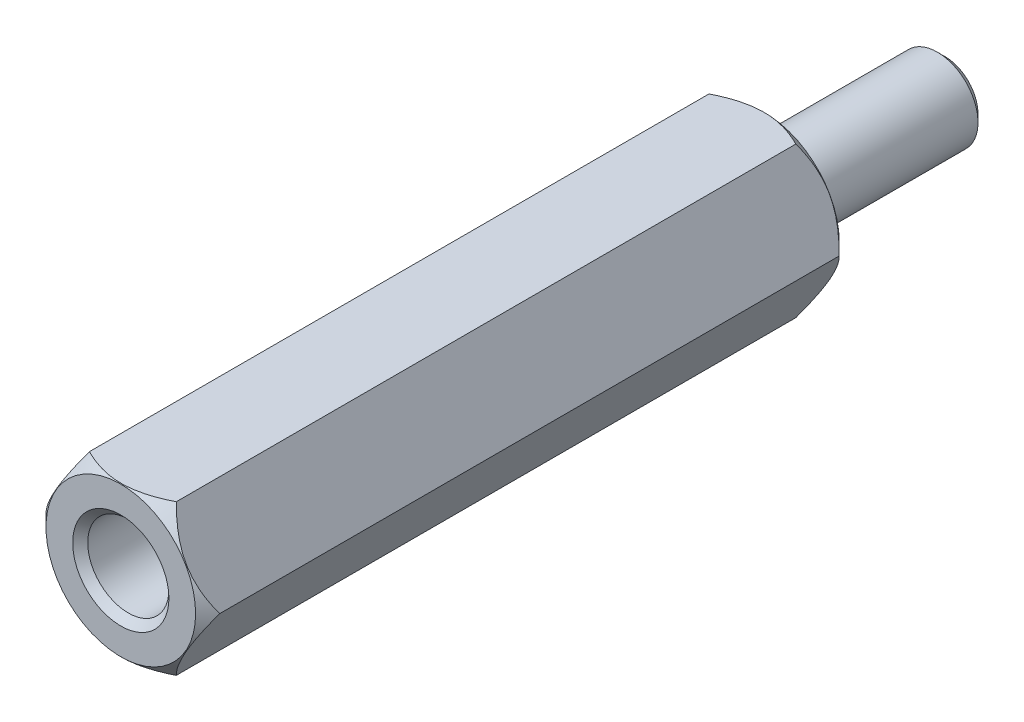
ISO-10303-21;
HEADER;
FILE_DESCRIPTION(('STEP AP214'),'2;1');
FILE_NAME('part.step','',(''),(''),'','','');
FILE_SCHEMA(('AUTOMOTIVE_DESIGN { 1 0 10303 214 1 1 1 1 }'));
ENDSEC;
DATA;
#1=APPLICATION_CONTEXT('core data for automotive mechanical design processes');
#2=APPLICATION_PROTOCOL_DEFINITION('international standard','automotive_design',2000,#1);
#3=PRODUCT_CONTEXT('',#1,'mechanical');
#4=PRODUCT('Part','Part','',(#3));
#5=PRODUCT_RELATED_PRODUCT_CATEGORY('part','',(#4));
#6=PRODUCT_DEFINITION_FORMATION('','',#4);
#7=PRODUCT_DEFINITION_CONTEXT('part definition',#1,'design');
#8=PRODUCT_DEFINITION('design','',#6,#7);
#9=PRODUCT_DEFINITION_SHAPE('','',#8);
#10=(LENGTH_UNIT() NAMED_UNIT(*) SI_UNIT(.MILLI.,.METRE.));
#11=(NAMED_UNIT(*) PLANE_ANGLE_UNIT() SI_UNIT($,.RADIAN.));
#12=(NAMED_UNIT(*) SI_UNIT($,.STERADIAN.) SOLID_ANGLE_UNIT());
#13=UNCERTAINTY_MEASURE_WITH_UNIT(LENGTH_MEASURE(1.E-05),#10,'distance_accuracy_value','');
#14=(GEOMETRIC_REPRESENTATION_CONTEXT(3) GLOBAL_UNCERTAINTY_ASSIGNED_CONTEXT((#13)) GLOBAL_UNIT_ASSIGNED_CONTEXT((#10,
#11,#12)) REPRESENTATION_CONTEXT('',''));
#15=CARTESIAN_POINT('',(0.,0.,0.));
#16=DIRECTION('',(0.,0.,1.));
#17=DIRECTION('',(1.,0.,0.));
#18=AXIS2_PLACEMENT_3D('',#15,#16,#17);
#19=CARTESIAN_POINT('',(0.,0.,10.7));
#20=DIRECTION('',(0.,0.,1.));
#21=DIRECTION('',(1.,0.,0.));
#22=AXIS2_PLACEMENT_3D('',#19,#20,#21);
#23=CYLINDRICAL_SURFACE('',#22,1.35);
#24=CARTESIAN_POINT('',(0.,0.,10.45));
#25=DIRECTION('',(0.,0.,1.));
#26=DIRECTION('',(1.,0.,0.));
#27=AXIS2_PLACEMENT_3D('',#24,#25,#26);
#28=CIRCLE('',#27,1.35);
#29=CARTESIAN_POINT('',(1.35,0.,10.45));
#30=VERTEX_POINT('',#29);
#31=EDGE_CURVE('E53',#30,#30,#28,.T.);
#32=ORIENTED_EDGE('',*,*,#31,.T.);
#33=EDGE_LOOP('',(#32));
#34=FACE_BOUND('',#33,.T.);
#35=CARTESIAN_POINT('',(0.,0.,-8.7));
#36=DIRECTION('',(0.,0.,-1.));
#37=DIRECTION('',(-1.,0.,0.));
#38=AXIS2_PLACEMENT_3D('',#35,#36,#37);
#39=CIRCLE('',#38,1.35);
#40=CARTESIAN_POINT('',(-1.35,0.,-8.7));
#41=VERTEX_POINT('',#40);
#42=EDGE_CURVE('E120',#41,#41,#39,.F.);
#43=ORIENTED_EDGE('',*,*,#42,.F.);
#44=EDGE_LOOP('',(#43));
#45=FACE_BOUND('',#44,.T.);
#46=ADVANCED_FACE('F43',(#34,#45),#23,.F.);
#47=CARTESIAN_POINT('',(1.44337567297409,-2.49999999999998,10.7));
#48=DIRECTION('',(-0.866025403784441,0.499999999999995,0.));
#49=DIRECTION('',(-0.499999999999995,-0.866025403784442,0.));
#50=AXIS2_PLACEMENT_3D('',#47,#48,#49);
#51=PLANE('',#50);
#52=CARTESIAN_POINT('',(1.44326020292026,-2.50019999999999,10.2998845230182));
#53=CARTESIAN_POINT('',(1.49287669073471,-2.41426172221222,10.3494592946453));
#54=CARTESIAN_POINT('',(1.54332283764112,-2.32688643272423,10.3961225186375));
#55=CARTESIAN_POINT('',(1.64618811625262,-2.1487185438344,10.4815618599617));
#56=CARTESIAN_POINT('',(1.69861703122362,-2.05790899931892,10.520290437594));
#57=CARTESIAN_POINT('',(1.80433744175988,-1.87479587687307,10.5866332961023));
#58=CARTESIAN_POINT('',(1.85760201171318,-1.78253893547065,10.6144143314691));
#59=CARTESIAN_POINT('',(1.96530378549011,-1.59599399122371,10.6572168240893));
#60=CARTESIAN_POINT('',(2.01973769896308,-1.50171168743371,10.6722702333286));
#61=CARTESIAN_POINT('',(2.11355131286834,-1.33922174170815,10.6858522777905));
#62=CARTESIAN_POINT('',(2.15280980880343,-1.27122403211985,10.6878629007592));
#63=CARTESIAN_POINT('',(2.23126263056551,-1.13533975883078,10.6844758828125));
#64=CARTESIAN_POINT('',(2.27045692907359,-1.06745324244776,10.6790756447002));
#65=CARTESIAN_POINT('',(2.34847544336506,-0.93232121176389,10.6611742115975));
#66=CARTESIAN_POINT('',(2.38729919566124,-0.865076500246435,10.6486650729535));
#67=CARTESIAN_POINT('',(2.46427534467605,-0.731749899181796,10.6172324980443));
#68=CARTESIAN_POINT('',(2.50242779262543,-0.665667920900338,10.5983095535032));
#69=CARTESIAN_POINT('',(2.60015256308363,-0.496403653308731,10.5421326385917));
#70=CARTESIAN_POINT('',(2.65911894852989,-0.394270877777104,10.5006441684038));
#71=CARTESIAN_POINT('',(2.74582384890658,-0.244093585059488,10.4306059532769));
#72=CARTESIAN_POINT('',(2.77439698586413,-0.194603460117388,10.4059977478839));
#73=CARTESIAN_POINT('',(2.83101398781794,-0.0965399361611517,10.3545381132848));
#74=CARTESIAN_POINT('',(2.85905816495513,-0.047965996503071,10.3276880612206));
#75=CARTESIAN_POINT('',(2.88686681600197,0.000200000000000372,10.2998845230182));
#76=B_SPLINE_CURVE_WITH_KNOTS('',3,(#52,#53,#54,#55,#56,#57,#58,#59,#60,#61,#62,#63,#64,#65,#66,
#67,#68,#69,#70,#71,#72,#73,#74,#75),.UNSPECIFIED.,.F.,.F.,(4,2,2,2,2,2,2,2,2,2,2,4),(0.,
0.333012085133919,0.667964518301388,0.997597032043286,1.32639954393843,1.56169424147167,
1.79707142102081,2.03271213522169,2.26833478775649,2.64260240809531,2.82922877818861,
3.01574133749022),.UNSPECIFIED.);
#77=CARTESIAN_POINT('',(1.44337567297409,-2.49999999999998,10.3));
#78=VERTEX_POINT('',#77);
#79=CARTESIAN_POINT('',(2.88675134594813,0.,10.3));
#80=VERTEX_POINT('',#79);
#81=EDGE_CURVE('E97',#78,#80,#76,.T.);
#82=ORIENTED_EDGE('',*,*,#81,.F.);
#83=DIRECTION('',(0.,0.,-1.));
#84=VECTOR('',#83,1.);
#85=CARTESIAN_POINT('',(1.44337567297409,-2.49999999999998,10.7));
#86=LINE('',#85,#84);
#87=CARTESIAN_POINT('',(1.44337567297409,-2.49999999999998,-10.3));
#88=VERTEX_POINT('',#87);
#89=EDGE_CURVE('E68',#78,#88,#86,.T.);
#90=ORIENTED_EDGE('',*,*,#89,.T.);
#91=CARTESIAN_POINT('',(2.88686681600197,0.000200000000000127,-10.2998845230182));
#92=CARTESIAN_POINT('',(2.83725032818751,-0.0857382777877639,-10.3494592946453));
#93=CARTESIAN_POINT('',(2.7868041812811,-0.173113567275752,-10.3961225186375));
#94=CARTESIAN_POINT('',(2.68393890266961,-0.351281456165585,-10.4815618599617));
#95=CARTESIAN_POINT('',(2.63150998769861,-0.442091000681071,-10.520290437594));
#96=CARTESIAN_POINT('',(2.52578957716235,-0.625204123126915,-10.5866332961023));
#97=CARTESIAN_POINT('',(2.47252500720905,-0.717461064529334,-10.6144143314691));
#98=CARTESIAN_POINT('',(2.36482323343211,-0.904006008776278,-10.6572168240893));
#99=CARTESIAN_POINT('',(2.31038931995914,-0.998288312566274,-10.6722702333286));
#100=CARTESIAN_POINT('',(2.21657570605388,-1.16077825829184,-10.6858522777905));
#101=CARTESIAN_POINT('',(2.1773172101188,-1.22877596788014,-10.6878629007592));
#102=CARTESIAN_POINT('',(2.09886438835672,-1.36466024116921,-10.6844758828125));
#103=CARTESIAN_POINT('',(2.05967008984864,-1.43254675755223,-10.6790756447002));
#104=CARTESIAN_POINT('',(1.98165157555717,-1.5676787882361,-10.6611742115975));
#105=CARTESIAN_POINT('',(1.94282782326099,-1.63492349975355,-10.6486650729535));
#106=CARTESIAN_POINT('',(1.86585167424618,-1.76825010081819,-10.6172324980443));
#107=CARTESIAN_POINT('',(1.8276992262968,-1.83433207909965,-10.5983095535032));
#108=CARTESIAN_POINT('',(1.7299744558386,-2.00359634669125,-10.5421326385917));
#109=CARTESIAN_POINT('',(1.67100807039233,-2.10572912222288,-10.5006441684038));
#110=CARTESIAN_POINT('',(1.58430317001565,-2.2559064149405,-10.4306059532769));
#111=CARTESIAN_POINT('',(1.5557300330581,-2.3053965398826,-10.4059977478839));
#112=CARTESIAN_POINT('',(1.49911303110428,-2.40346006383883,-10.3545381132848));
#113=CARTESIAN_POINT('',(1.47106885396709,-2.45203400349691,-10.3276880612206));
#114=CARTESIAN_POINT('',(1.44326020292026,-2.50019999999999,-10.2998845230182));
#115=B_SPLINE_CURVE_WITH_KNOTS('',3,(#91,#92,#93,#94,#95,#96,#97,#98,#99,#100,#101,#102,#103,
#104,#105,#106,#107,#108,#109,#110,#111,#112,#113,#114),.UNSPECIFIED.,.F.,.F.,(4,2,2,2,2,2,2,2,
2,2,2,4),(0.,0.33301208513392,0.667964518301389,0.997597032043287,1.32639954393843,
1.56169424147167,1.79707142102081,2.03271213522169,2.26833478775649,2.64260240809531,
2.82922877818861,3.01574133749022),.UNSPECIFIED.);
#116=CARTESIAN_POINT('',(2.88675134594813,0.,-10.3));
#117=VERTEX_POINT('',#116);
#118=EDGE_CURVE('E118',#117,#88,#115,.T.);
#119=ORIENTED_EDGE('',*,*,#118,.F.);
#120=DIRECTION('',(0.,0.,-1.));
#121=VECTOR('',#120,1.);
#122=CARTESIAN_POINT('',(2.88675134594813,0.,10.7));
#123=LINE('',#122,#121);
#124=EDGE_CURVE('E111',#80,#117,#123,.T.);
#125=ORIENTED_EDGE('',*,*,#124,.F.);
#126=EDGE_LOOP('',(#82,#90,#119,#125));
#127=FACE_BOUND('',#126,.T.);
#128=ADVANCED_FACE('F117',(#127),#51,.F.);
#129=CARTESIAN_POINT('',(2.88675134594813,0.,10.7));
#130=DIRECTION('',(-0.866025403784438,-0.500000000000001,0.));
#131=DIRECTION('',(0.500000000000001,-0.866025403784438,0.));
#132=AXIS2_PLACEMENT_3D('',#129,#130,#131);
#133=PLANE('',#132);
#134=CARTESIAN_POINT('',(2.88686681600197,-0.000199999999999787,10.2998845230182));
#135=CARTESIAN_POINT('',(2.83725032818751,0.0857382777877644,10.3494592946453));
#136=CARTESIAN_POINT('',(2.7868041812811,0.173113567275753,10.3961225186375));
#137=CARTESIAN_POINT('',(2.6839389026696,0.351281456165588,10.4815618599617));
#138=CARTESIAN_POINT('',(2.6315099876986,0.442091000681074,10.520290437594));
#139=CARTESIAN_POINT('',(2.52578957716234,0.625204123126919,10.5866332961023));
#140=CARTESIAN_POINT('',(2.47252500720904,0.717461064529338,10.6144143314691));
#141=CARTESIAN_POINT('',(2.3648232334321,0.904006008776283,10.6572168240893));
#142=CARTESIAN_POINT('',(2.31038931995913,0.998288312566281,10.6722702333287));
#143=CARTESIAN_POINT('',(2.21657570605387,1.16077825829184,10.6858522777905));
#144=CARTESIAN_POINT('',(2.17731721011878,1.22877596788015,10.6878629007592));
#145=CARTESIAN_POINT('',(2.0988643883567,1.36466024116921,10.6844758828125));
#146=CARTESIAN_POINT('',(2.05967008984862,1.43254675755223,10.6790756447002));
#147=CARTESIAN_POINT('',(1.98165157555715,1.5676787882361,10.6611742115975));
#148=CARTESIAN_POINT('',(1.94282782326097,1.63492349975355,10.6486650729535));
#149=CARTESIAN_POINT('',(1.86585167424616,1.76825010081819,10.6172324980443));
#150=CARTESIAN_POINT('',(1.82769922629678,1.83433207909965,10.5983095535032));
#151=CARTESIAN_POINT('',(1.72997445583858,2.00359634669126,10.5421326385918));
#152=CARTESIAN_POINT('',(1.67100807039231,2.10572912222289,10.5006441684038));
#153=CARTESIAN_POINT('',(1.58430317001562,2.25590641494051,10.4306059532769));
#154=CARTESIAN_POINT('',(1.55573003305807,2.30539653988261,10.4059977478839));
#155=CARTESIAN_POINT('',(1.49911303110425,2.40346006383885,10.3545381132848));
#156=CARTESIAN_POINT('',(1.47106885396706,2.45203400349693,10.3276880612206));
#157=CARTESIAN_POINT('',(1.44326020292022,2.50020000000001,10.2998845230182));
#158=B_SPLINE_CURVE_WITH_KNOTS('',3,(#134,#135,#136,#137,#138,#139,#140,#141,#142,#143,#144,
#145,#146,#147,#148,#149,#150,#151,#152,#153,#154,#155,#156,#157),.UNSPECIFIED.,.F.,.F.,(4,2,2,
2,2,2,2,2,2,2,2,4),(0.,0.333012085133923,0.667964518301396,0.997597032043297,1.32639954393844,
1.56169424147168,1.79707142102082,2.0327121352217,2.2683347877565,2.64260240809533,
2.82922877818864,3.01574133749026),.UNSPECIFIED.);
#159=CARTESIAN_POINT('',(1.44337567297406,2.50000000000001,10.3));
#160=VERTEX_POINT('',#159);
#161=EDGE_CURVE('E100',#80,#160,#158,.T.);
#162=ORIENTED_EDGE('',*,*,#161,.F.);
#163=ORIENTED_EDGE('',*,*,#124,.T.);
#164=CARTESIAN_POINT('',(1.44326020292022,2.50020000000001,-10.2998845230182));
#165=CARTESIAN_POINT('',(1.49287669073468,2.41426172221224,-10.3494592946453));
#166=CARTESIAN_POINT('',(1.54332283764109,2.32688643272425,-10.3961225186375));
#167=CARTESIAN_POINT('',(1.64618811625259,2.14871854383442,-10.4815618599617));
#168=CARTESIAN_POINT('',(1.69861703122359,2.05790899931893,-10.520290437594));
#169=CARTESIAN_POINT('',(1.80433744175985,1.87479587687309,-10.5866332961023));
#170=CARTESIAN_POINT('',(1.85760201171315,1.78253893547067,-10.6144143314691));
#171=CARTESIAN_POINT('',(1.96530378549009,1.59599399122372,-10.6572168240893));
#172=CARTESIAN_POINT('',(2.01973769896306,1.50171168743372,-10.6722702333287));
#173=CARTESIAN_POINT('',(2.11355131286832,1.33922174170816,-10.6858522777905));
#174=CARTESIAN_POINT('',(2.15280980880341,1.27122403211986,-10.6878629007592));
#175=CARTESIAN_POINT('',(2.23126263056549,1.13533975883079,-10.6844758828125));
#176=CARTESIAN_POINT('',(2.27045692907357,1.06745324244777,-10.6790756447002));
#177=CARTESIAN_POINT('',(2.34847544336504,0.932321211763905,-10.6611742115975));
#178=CARTESIAN_POINT('',(2.38729919566122,0.865076500246451,-10.6486650729535));
#179=CARTESIAN_POINT('',(2.46427534467603,0.731749899181814,-10.6172324980443));
#180=CARTESIAN_POINT('',(2.50242779262541,0.665667920900356,-10.5983095535032));
#181=CARTESIAN_POINT('',(2.60015256308361,0.496403653308746,-10.5421326385918));
#182=CARTESIAN_POINT('',(2.65911894852988,0.394270877777116,-10.5006441684038));
#183=CARTESIAN_POINT('',(2.74582384890657,0.244093585059497,-10.4306059532769));
#184=CARTESIAN_POINT('',(2.77439698586412,0.194603460117396,-10.4059977478839));
#185=CARTESIAN_POINT('',(2.83101398781794,0.0965399361611562,-10.3545381132848));
#186=CARTESIAN_POINT('',(2.85905816495513,0.0479659965030738,-10.3276880612206));
#187=CARTESIAN_POINT('',(2.88686681600197,-0.000199999999999583,-10.2998845230182));
#188=B_SPLINE_CURVE_WITH_KNOTS('',3,(#164,#165,#166,#167,#168,#169,#170,#171,#172,#173,#174,
#175,#176,#177,#178,#179,#180,#181,#182,#183,#184,#185,#186,#187),.UNSPECIFIED.,.F.,.F.,(4,2,2,
2,2,2,2,2,2,2,2,4),(0.,0.333012085133923,0.667964518301396,0.997597032043298,1.32639954393844,
1.56169424147168,1.79707142102082,2.0327121352217,2.2683347877565,2.64260240809533,
2.82922877818864,3.01574133749026),.UNSPECIFIED.);
#189=CARTESIAN_POINT('',(1.44337567297406,2.50000000000001,-10.3));
#190=VERTEX_POINT('',#189);
#191=EDGE_CURVE('E250',#190,#117,#188,.T.);
#192=ORIENTED_EDGE('',*,*,#191,.F.);
#193=DIRECTION('',(0.,0.,-1.));
#194=VECTOR('',#193,1.);
#195=CARTESIAN_POINT('',(1.44337567297406,2.50000000000001,10.7));
#196=LINE('',#195,#194);
#197=EDGE_CURVE('E113',#160,#190,#196,.T.);
#198=ORIENTED_EDGE('',*,*,#197,.F.);
#199=EDGE_LOOP('',(#162,#163,#192,#198));
#200=FACE_BOUND('',#199,.T.);
#201=ADVANCED_FACE('F109',(#200),#133,.F.);
#202=CARTESIAN_POINT('',(1.44337567297406,2.50000000000001,10.7));
#203=DIRECTION('',(0.,-1.,0.));
#204=DIRECTION('',(1.,0.,0.));
#205=AXIS2_PLACEMENT_3D('',#202,#203,#204);
#206=PLANE('',#205);
#207=CARTESIAN_POINT('',(4.35790807222665,2.50000000000002,8.16267304580408));
#208=CARTESIAN_POINT('',(4.22900505074815,2.50000000000001,8.27444020651167));
#209=CARTESIAN_POINT('',(4.09952897907173,2.50000000000001,8.38556009439582));
#210=CARTESIAN_POINT('',(3.83898638028681,2.50000000000001,8.60604374915113));
#211=CARTESIAN_POINT('',(3.70791912620545,2.50000000000001,8.71540665588042));
#212=CARTESIAN_POINT('',(3.44083760855068,2.50000000000001,8.9342940749196));
#213=CARTESIAN_POINT('',(3.30477887797079,2.50000000000001,9.04376454299068));
#214=CARTESIAN_POINT('',(3.03009587684348,2.50000000000001,9.25938263287971));
#215=CARTESIAN_POINT('',(2.89147225782007,2.50000000000001,9.36553108059659));
#216=CARTESIAN_POINT('',(2.61062429451693,2.50000000000001,9.57338578520496));
#217=CARTESIAN_POINT('',(2.46839537969834,2.50000000000001,9.67508590704004));
#218=CARTESIAN_POINT('',(2.1792548679078,2.50000000000001,9.87194970638111));
#219=CARTESIAN_POINT('',(2.03233957265132,2.50000000000001,9.96710802470616));
#220=CARTESIAN_POINT('',(1.73361597358269,2.50000000000001,10.1468083373489));
#221=CARTESIAN_POINT('',(1.58185407011246,2.50000000000001,10.2314264527755));
#222=CARTESIAN_POINT('',(1.27084130527911,2.5,10.3855259959545));
#223=CARTESIAN_POINT('',(1.11160488303033,2.5,10.4550352568887));
#224=CARTESIAN_POINT('',(0.864657376231813,2.5,10.5425964251353));
#225=CARTESIAN_POINT('',(0.77999302622253,2.5,10.5692004630506));
#226=CARTESIAN_POINT('',(0.608668935092183,2.5,10.6150458234607));
#227=CARTESIAN_POINT('',(0.522009514777902,2.5,10.6342883210428));
#228=CARTESIAN_POINT('',(0.347739556932347,2.5,10.6641318069513));
#229=CARTESIAN_POINT('',(0.260138222188833,2.5,10.6747855278333));
#230=CARTESIAN_POINT('',(0.0842961272603256,2.5,10.6868677030715));
#231=CARTESIAN_POINT('',(-0.00394456438843409,2.5,10.6882971320023));
#232=CARTESIAN_POINT('',(-0.180192018780201,2.5,10.6818160827615));
#233=CARTESIAN_POINT('',(-0.268198313940574,2.5,10.6738931726444));
#234=CARTESIAN_POINT('',(-0.442968473014165,2.5,10.6492869360214));
#235=CARTESIAN_POINT('',(-0.529732088460496,2.5,10.6326018820153));
#236=CARTESIAN_POINT('',(-0.702003641636127,2.5,10.5914180760622));
#237=CARTESIAN_POINT('',(-0.787498274243343,2.5,10.5668646390626));
#238=CARTESIAN_POINT('',(-0.956318998116772,2.5,10.5112722791982));
#239=CARTESIAN_POINT('',(-1.03964506444262,2.5,10.480233281781));
#240=CARTESIAN_POINT('',(-1.22260914379835,2.5,10.4053275261388));
#241=CARTESIAN_POINT('',(-1.32170415747563,2.5,10.3601455930875));
#242=CARTESIAN_POINT('',(-1.51694385371059,2.49999999999999,10.2637551537921));
#243=CARTESIAN_POINT('',(-1.61308679170484,2.49999999999999,10.212543167265));
#244=CARTESIAN_POINT('',(-1.80296614219628,2.49999999999999,10.105431667411));
#245=CARTESIAN_POINT('',(-1.89669715950606,2.49999999999999,10.0495226676025));
#246=CARTESIAN_POINT('',(-2.08192800240938,2.49999999999999,9.93418674307867));
#247=CARTESIAN_POINT('',(-2.17342826625812,2.49999999999999,9.87476051735269));
#248=CARTESIAN_POINT('',(-2.35505847652758,2.49999999999999,9.75284030367594));
#249=CARTESIAN_POINT('',(-2.445178569973,2.49999999999999,9.69033170499247));
#250=CARTESIAN_POINT('',(-2.62385919422445,2.49999999999999,9.5631187500085));
#251=CARTESIAN_POINT('',(-2.71241960671451,2.49999999999999,9.49841422820778));
#252=CARTESIAN_POINT('',(-2.9759396860953,2.49999999999999,9.30184992046114));
#253=CARTESIAN_POINT('',(-3.14895696314837,2.49999999999999,9.16738929484152));
#254=CARTESIAN_POINT('',(-3.49727644035012,2.49999999999999,8.88911816701071));
#255=CARTESIAN_POINT('',(-3.67244750970816,2.49999999999999,8.74514512901895));
#256=CARTESIAN_POINT('',(-3.93212110001528,2.49999999999999,8.52741624538674));
#257=CARTESIAN_POINT('',(-4.01770626505474,2.49999999999999,8.45494531232854));
#258=CARTESIAN_POINT('',(-4.1882495214834,2.49999999999999,8.30930608888148));
#259=CARTESIAN_POINT('',(-4.27320774421479,2.49999999999999,8.23613795236392));
#260=CARTESIAN_POINT('',(-4.35790807222667,2.49999999999999,8.16267304580408));
#261=B_SPLINE_CURVE_WITH_KNOTS('',3,(#207,#208,#209,#210,#211,#212,#213,#214,#215,#216,#217,
#218,#219,#220,#221,#222,#223,#224,#225,#226,#227,#228,#229,#230,#231,#232,#233,#234,#235,#236,
#237,#238,#239,#240,#241,#242,#243,#244,#245,#246,#247,#248,#249,#250,#251,#252,#253,#254,#255,
#256,#257,#258,#259,#260),.UNSPECIFIED.,.F.,.F.,(4,2,2,2,2,2,2,2,2,2,2,2,2,2,2,2,2,2,2,2,2,2,2,
2,2,2,4),(0.,0.511842212813335,1.02392780167291,1.54778169920521,2.07150430797679,
2.59592780979256,3.12077593308527,3.6415817306556,4.16141982425733,4.42739176689035,
4.69332123596951,4.95760526901694,5.22186137919604,5.48646915760419,5.75112912434678,
6.01766988465733,6.28421370906122,6.61066447125654,6.93730457870704,7.26462103112127,
7.59187265192314,7.92086150920109,8.24987521669911,8.90710736338418,9.5872861612455,
9.92372274140157,10.2600867154781),.UNSPECIFIED.);
#262=CARTESIAN_POINT('',(-1.44337567297408,2.5,10.3));
#263=VERTEX_POINT('',#262);
#264=EDGE_CURVE('E115',#160,#263,#261,.T.);
#265=ORIENTED_EDGE('',*,*,#264,.F.);
#266=ORIENTED_EDGE('',*,*,#197,.T.);
#267=CARTESIAN_POINT('',(-4.35790807222667,2.49999999999999,-8.16267304580408));
#268=CARTESIAN_POINT('',(-4.22900505074817,2.49999999999999,-8.27444020651167));
#269=CARTESIAN_POINT('',(-4.09952897907174,2.49999999999999,-8.38556009439582));
#270=CARTESIAN_POINT('',(-3.83898638028683,2.49999999999999,-8.60604374915113));
#271=CARTESIAN_POINT('',(-3.70791912620547,2.49999999999999,-8.71540665588042));
#272=CARTESIAN_POINT('',(-3.44083760855069,2.49999999999999,-8.9342940749196));
#273=CARTESIAN_POINT('',(-3.30477887797081,2.49999999999999,-9.04376454299068));
#274=CARTESIAN_POINT('',(-3.03009587684349,2.49999999999999,-9.25938263287971));
#275=CARTESIAN_POINT('',(-2.89147225782009,2.49999999999999,-9.36553108059659));
#276=CARTESIAN_POINT('',(-2.61062429451694,2.49999999999999,-9.57338578520496));
#277=CARTESIAN_POINT('',(-2.46839537969836,2.49999999999999,-9.67508590704004));
#278=CARTESIAN_POINT('',(-2.17925486790782,2.49999999999999,-9.87194970638111));
#279=CARTESIAN_POINT('',(-2.03233957265134,2.49999999999999,-9.96710802470616));
#280=CARTESIAN_POINT('',(-1.73361597358271,2.49999999999999,-10.1468083373489));
#281=CARTESIAN_POINT('',(-1.58185407011248,2.49999999999999,-10.2314264527755));
#282=CARTESIAN_POINT('',(-1.27084130527913,2.5,-10.3855259959545));
#283=CARTESIAN_POINT('',(-1.11160488303035,2.5,-10.4550352568887));
#284=CARTESIAN_POINT('',(-0.864657376231833,2.5,-10.5425964251353));
#285=CARTESIAN_POINT('',(-0.779993026222549,2.5,-10.5692004630506));
#286=CARTESIAN_POINT('',(-0.608668935092202,2.5,-10.6150458234607));
#287=CARTESIAN_POINT('',(-0.522009514777922,2.5,-10.6342883210428));
#288=CARTESIAN_POINT('',(-0.347739556932367,2.5,-10.6641318069513));
#289=CARTESIAN_POINT('',(-0.260138222188853,2.5,-10.6747855278333));
#290=CARTESIAN_POINT('',(-0.0842961272603451,2.5,-10.6868677030715));
#291=CARTESIAN_POINT('',(0.0039445643884146,2.5,-10.6882971320023));
#292=CARTESIAN_POINT('',(0.180192018780182,2.5,-10.6818160827615));
#293=CARTESIAN_POINT('',(0.268198313940555,2.5,-10.6738931726444));
#294=CARTESIAN_POINT('',(0.442968473014146,2.5,-10.6492869360214));
#295=CARTESIAN_POINT('',(0.529732088460477,2.5,-10.6326018820153));
#296=CARTESIAN_POINT('',(0.702003641636108,2.5,-10.5914180760622));
#297=CARTESIAN_POINT('',(0.787498274243325,2.5,-10.5668646390626));
#298=CARTESIAN_POINT('',(0.956318998116754,2.5,-10.5112722791982));
#299=CARTESIAN_POINT('',(1.0396450644426,2.5,-10.480233281781));
#300=CARTESIAN_POINT('',(1.22260914379833,2.5,-10.4053275261388));
#301=CARTESIAN_POINT('',(1.32170415747562,2.5,-10.3601455930875));
#302=CARTESIAN_POINT('',(1.51694385371057,2.50000000000001,-10.2637551537921));
#303=CARTESIAN_POINT('',(1.61308679170483,2.50000000000001,-10.212543167265));
#304=CARTESIAN_POINT('',(1.80296614219626,2.50000000000001,-10.105431667411));
#305=CARTESIAN_POINT('',(1.89669715950604,2.50000000000001,-10.0495226676025));
#306=CARTESIAN_POINT('',(2.08192800240936,2.50000000000001,-9.93418674307867));
#307=CARTESIAN_POINT('',(2.1734282662581,2.50000000000001,-9.87476051735269));
#308=CARTESIAN_POINT('',(2.35505847652756,2.50000000000001,-9.75284030367594));
#309=CARTESIAN_POINT('',(2.44517856997298,2.50000000000001,-9.69033170499247));
#310=CARTESIAN_POINT('',(2.62385919422443,2.50000000000001,-9.5631187500085));
#311=CARTESIAN_POINT('',(2.71241960671449,2.50000000000001,-9.49841422820778));
#312=CARTESIAN_POINT('',(2.97593968609528,2.50000000000001,-9.30184992046114));
#313=CARTESIAN_POINT('',(3.14895696314835,2.50000000000001,-9.16738929484152));
#314=CARTESIAN_POINT('',(3.4972764403501,2.50000000000001,-8.88911816701071));
#315=CARTESIAN_POINT('',(3.67244750970814,2.50000000000001,-8.74514512901895));
#316=CARTESIAN_POINT('',(3.93212110001526,2.50000000000001,-8.52741624538674));
#317=CARTESIAN_POINT('',(4.01770626505472,2.50000000000001,-8.45494531232854));
#318=CARTESIAN_POINT('',(4.18824952148338,2.50000000000001,-8.30930608888148));
#319=CARTESIAN_POINT('',(4.27320774421478,2.50000000000001,-8.23613795236392));
#320=CARTESIAN_POINT('',(4.35790807222665,2.50000000000002,-8.16267304580408));
#321=B_SPLINE_CURVE_WITH_KNOTS('',3,(#267,#268,#269,#270,#271,#272,#273,#274,#275,#276,#277,
#278,#279,#280,#281,#282,#283,#284,#285,#286,#287,#288,#289,#290,#291,#292,#293,#294,#295,#296,
#297,#298,#299,#300,#301,#302,#303,#304,#305,#306,#307,#308,#309,#310,#311,#312,#313,#314,#315,
#316,#317,#318,#319,#320),.UNSPECIFIED.,.F.,.F.,(4,2,2,2,2,2,2,2,2,2,2,2,2,2,2,2,2,2,2,2,2,2,2,
2,2,2,4),(0.,0.511842212813336,1.02392780167291,1.54778169920521,2.07150430797679,
2.59592780979256,3.12077593308527,3.6415817306556,4.16141982425733,4.42739176689035,
4.69332123596951,4.95760526901694,5.22186137919604,5.48646915760419,5.75112912434678,
6.01766988465733,6.28421370906122,6.61066447125654,6.93730457870704,7.26462103112127,
7.59187265192314,7.92086150920109,8.24987521669912,8.90710736338418,9.5872861612455,
9.92372274140157,10.2600867154781),.UNSPECIFIED.);
#322=CARTESIAN_POINT('',(-1.44337567297408,2.5,-10.3));
#323=VERTEX_POINT('',#322);
#324=EDGE_CURVE('E258',#323,#190,#321,.T.);
#325=ORIENTED_EDGE('',*,*,#324,.F.);
#326=DIRECTION('',(0.,0.,-1.));
#327=VECTOR('',#326,1.);
#328=CARTESIAN_POINT('',(-1.44337567297408,2.5,10.7));
#329=LINE('',#328,#327);
#330=EDGE_CURVE('E127',#263,#323,#329,.T.);
#331=ORIENTED_EDGE('',*,*,#330,.F.);
#332=EDGE_LOOP('',(#265,#266,#325,#331));
#333=FACE_BOUND('',#332,.T.);
#334=ADVANCED_FACE('F244',(#333),#206,.F.);
#335=CARTESIAN_POINT('',(-1.44337567297408,2.5,10.7));
#336=DIRECTION('',(0.866025403784441,-0.499999999999995,0.));
#337=DIRECTION('',(0.499999999999995,0.866025403784442,0.));
#338=AXIS2_PLACEMENT_3D('',#335,#336,#337);
#339=PLANE('',#338);
#340=CARTESIAN_POINT('',(-1.44326020292024,2.5002,10.2998845230182));
#341=CARTESIAN_POINT('',(-1.4928766907347,2.41426172221223,10.3494592946453));
#342=CARTESIAN_POINT('',(-1.54332283764111,2.32688643272424,10.3961225186375));
#343=CARTESIAN_POINT('',(-1.6461881162526,2.14871854383441,10.4815618599617));
#344=CARTESIAN_POINT('',(-1.6986170312236,2.05790899931892,10.520290437594));
#345=CARTESIAN_POINT('',(-1.80433744175986,1.87479587687307,10.5866332961023));
#346=CARTESIAN_POINT('',(-1.85760201171316,1.78253893547065,10.6144143314691));
#347=CARTESIAN_POINT('',(-1.9653037854901,1.59599399122371,10.6572168240893));
#348=CARTESIAN_POINT('',(-2.01973769896307,1.50171168743371,10.6722702333287));
#349=CARTESIAN_POINT('',(-2.11355131286833,1.33922174170815,10.6858522777905));
#350=CARTESIAN_POINT('',(-2.15280980880342,1.27122403211984,10.6878629007592));
#351=CARTESIAN_POINT('',(-2.2312626305655,1.13533975883077,10.6844758828125));
#352=CARTESIAN_POINT('',(-2.27045692907358,1.06745324244776,10.6790756447002));
#353=CARTESIAN_POINT('',(-2.34847544336505,0.932321211763889,10.6611742115975));
#354=CARTESIAN_POINT('',(-2.38729919566123,0.865076500246435,10.6486650729535));
#355=CARTESIAN_POINT('',(-2.46427534467603,0.731749899181797,10.6172324980443));
#356=CARTESIAN_POINT('',(-2.50242779262542,0.665667920900339,10.5983095535032));
#357=CARTESIAN_POINT('',(-2.60015256308362,0.496403653308728,10.5421326385918));
#358=CARTESIAN_POINT('',(-2.65911894852989,0.394270877777098,10.5006441684038));
#359=CARTESIAN_POINT('',(-2.74582384890657,0.244093585059477,10.4306059532769));
#360=CARTESIAN_POINT('',(-2.77439698586412,0.194603460117375,10.4059977478839));
#361=CARTESIAN_POINT('',(-2.83101398781794,0.0965399361611348,10.3545381132848));
#362=CARTESIAN_POINT('',(-2.85905816495513,0.0479659965030524,10.3276880612206));
#363=CARTESIAN_POINT('',(-2.88686681600197,-0.000200000000020783,10.2998845230182));
#364=B_SPLINE_CURVE_WITH_KNOTS('',3,(#340,#341,#342,#343,#344,#345,#346,#347,#348,#349,#350,
#351,#352,#353,#354,#355,#356,#357,#358,#359,#360,#361,#362,#363),.UNSPECIFIED.,.F.,.F.,(4,2,2,
2,2,2,2,2,2,2,2,4),(0.,0.333012085133924,0.667964518301397,0.997597032043299,1.32639954393844,
1.56169424147168,1.79707142102082,2.0327121352217,2.2683347877565,2.64260240809533,
2.82922877818864,3.01574133749026),.UNSPECIFIED.);
#365=CARTESIAN_POINT('',(-2.88675134594813,0.,10.3));
#366=VERTEX_POINT('',#365);
#367=EDGE_CURVE('E222',#263,#366,#364,.T.);
#368=ORIENTED_EDGE('',*,*,#367,.F.);
#369=ORIENTED_EDGE('',*,*,#330,.T.);
#370=CARTESIAN_POINT('',(-2.88686681600197,-0.000200000000020285,-10.2998845230182));
#371=CARTESIAN_POINT('',(-2.83725032818751,0.0857382777877441,-10.3494592946453));
#372=CARTESIAN_POINT('',(-2.7868041812811,0.173113567275733,-10.3961225186375));
#373=CARTESIAN_POINT('',(-2.68393890266961,0.351281456165568,-10.4815618599617));
#374=CARTESIAN_POINT('',(-2.63150998769861,0.442091000681055,-10.520290437594));
#375=CARTESIAN_POINT('',(-2.52578957716234,0.625204123126901,-10.5866332961023));
#376=CARTESIAN_POINT('',(-2.47252500720905,0.717461064529321,-10.6144143314691));
#377=CARTESIAN_POINT('',(-2.36482323343211,0.904006008776267,-10.6572168240893));
#378=CARTESIAN_POINT('',(-2.31038931995914,0.998288312566264,-10.6722702333287));
#379=CARTESIAN_POINT('',(-2.21657570605388,1.16077825829183,-10.6858522777905));
#380=CARTESIAN_POINT('',(-2.17731721011879,1.22877596788013,-10.6878629007592));
#381=CARTESIAN_POINT('',(-2.09886438835671,1.3646602411692,-10.6844758828125));
#382=CARTESIAN_POINT('',(-2.05967008984863,1.43254675755222,-10.6790756447002));
#383=CARTESIAN_POINT('',(-1.98165157555716,1.56767878823609,-10.6611742115975));
#384=CARTESIAN_POINT('',(-1.94282782326098,1.63492349975354,-10.6486650729535));
#385=CARTESIAN_POINT('',(-1.86585167424617,1.76825010081818,-10.6172324980443));
#386=CARTESIAN_POINT('',(-1.82769922629679,1.83433207909964,-10.5983095535032));
#387=CARTESIAN_POINT('',(-1.72997445583859,2.00359634669125,-10.5421326385918));
#388=CARTESIAN_POINT('',(-1.67100807039232,2.10572912222288,-10.5006441684038));
#389=CARTESIAN_POINT('',(-1.58430317001564,2.2559064149405,-10.4306059532769));
#390=CARTESIAN_POINT('',(-1.55573003305809,2.3053965398826,-10.4059977478839));
#391=CARTESIAN_POINT('',(-1.49911303110427,2.40346006383884,-10.3545381132848));
#392=CARTESIAN_POINT('',(-1.47106885396707,2.45203400349692,-10.3276880612206));
#393=CARTESIAN_POINT('',(-1.44326020292024,2.5002,-10.2998845230182));
#394=B_SPLINE_CURVE_WITH_KNOTS('',3,(#370,#371,#372,#373,#374,#375,#376,#377,#378,#379,#380,
#381,#382,#383,#384,#385,#386,#387,#388,#389,#390,#391,#392,#393),.UNSPECIFIED.,.F.,.F.,(4,2,2,
2,2,2,2,2,2,2,2,4),(0.,0.333012085133924,0.667964518301396,0.997597032043298,1.32639954393844,
1.56169424147168,1.79707142102082,2.0327121352217,2.2683347877565,2.64260240809533,
2.82922877818864,3.01574133749026),.UNSPECIFIED.);
#395=CARTESIAN_POINT('',(-2.88675134594813,0.,-10.3));
#396=VERTEX_POINT('',#395);
#397=EDGE_CURVE('E285',#396,#323,#394,.T.);
#398=ORIENTED_EDGE('',*,*,#397,.F.);
#399=DIRECTION('',(0.,0.,-1.));
#400=VECTOR('',#399,1.);
#401=CARTESIAN_POINT('',(-2.88675134594813,0.,10.7));
#402=LINE('',#401,#400);
#403=EDGE_CURVE('E275',#366,#396,#402,.T.);
#404=ORIENTED_EDGE('',*,*,#403,.F.);
#405=EDGE_LOOP('',(#368,#369,#398,#404));
#406=FACE_BOUND('',#405,.T.);
#407=ADVANCED_FACE('F283',(#406),#339,.F.);
#408=CARTESIAN_POINT('',(-2.88675134594813,0.,10.7));
#409=DIRECTION('',(0.866025403784435,0.500000000000007,0.));
#410=DIRECTION('',(-0.500000000000007,0.866025403784435,0.));
#411=AXIS2_PLACEMENT_3D('',#408,#409,#410);
#412=PLANE('',#411);
#413=CARTESIAN_POINT('',(-2.88686681600197,0.000199999999979627,10.2998845230182));
#414=CARTESIAN_POINT('',(-2.83725032818751,-0.0857382777877845,10.3494592946453));
#415=CARTESIAN_POINT('',(-2.7868041812811,-0.173113567275772,10.3961225186375));
#416=CARTESIAN_POINT('',(-2.6839389026696,-0.351281456165606,10.4815618599617));
#417=CARTESIAN_POINT('',(-2.6315099876986,-0.442091000681092,10.520290437594));
#418=CARTESIAN_POINT('',(-2.52578957716233,-0.625204123126937,10.5866332961023));
#419=CARTESIAN_POINT('',(-2.47252500720904,-0.717461064529356,10.6144143314691));
#420=CARTESIAN_POINT('',(-2.3648232334321,-0.9040060087763,10.6572168240893));
#421=CARTESIAN_POINT('',(-2.31038931995912,-0.998288312566297,10.6722702333287));
#422=CARTESIAN_POINT('',(-2.21657570605386,-1.16077825829186,10.6858522777905));
#423=CARTESIAN_POINT('',(-2.17731721011877,-1.22877596788016,10.6878629007592));
#424=CARTESIAN_POINT('',(-2.09886438835669,-1.36466024116923,10.6844758828125));
#425=CARTESIAN_POINT('',(-2.05967008984861,-1.43254675755225,10.6790756447002));
#426=CARTESIAN_POINT('',(-1.98165157555714,-1.56767878823611,10.6611742115975));
#427=CARTESIAN_POINT('',(-1.94282782326096,-1.63492349975357,10.6486650729535));
#428=CARTESIAN_POINT('',(-1.86585167424615,-1.7682501008182,10.6172324980443));
#429=CARTESIAN_POINT('',(-1.82769922629677,-1.83433207909966,10.5983095535032));
#430=CARTESIAN_POINT('',(-1.72997445583856,-2.00359634669127,10.5421326385918));
#431=CARTESIAN_POINT('',(-1.67100807039229,-2.1057291222229,10.5006441684038));
#432=CARTESIAN_POINT('',(-1.58430317001561,-2.25590641494052,10.4306059532769));
#433=CARTESIAN_POINT('',(-1.55573003305805,-2.30539653988262,10.4059977478839));
#434=CARTESIAN_POINT('',(-1.49911303110423,-2.40346006383886,10.3545381132848));
#435=CARTESIAN_POINT('',(-1.47106885396704,-2.45203400349694,10.3276880612206));
#436=CARTESIAN_POINT('',(-1.4432602029202,-2.50020000000002,10.2998845230182));
#437=B_SPLINE_CURVE_WITH_KNOTS('',3,(#413,#414,#415,#416,#417,#418,#419,#420,#421,#422,#423,
#424,#425,#426,#427,#428,#429,#430,#431,#432,#433,#434,#435,#436),.UNSPECIFIED.,.F.,.F.,(4,2,2,
2,2,2,2,2,2,2,2,4),(0.,0.333012085133923,0.667964518301396,0.997597032043297,1.32639954393844,
1.56169424147168,1.79707142102082,2.0327121352217,2.2683347877565,2.64260240809533,
2.82922877818864,3.01574133749026),.UNSPECIFIED.);
#438=CARTESIAN_POINT('',(-1.44337567297404,-2.50000000000001,10.3));
#439=VERTEX_POINT('',#438);
#440=EDGE_CURVE('E60',#366,#439,#437,.T.);
#441=ORIENTED_EDGE('',*,*,#440,.F.);
#442=ORIENTED_EDGE('',*,*,#403,.T.);
#443=CARTESIAN_POINT('',(-1.4432602029202,-2.50020000000002,-10.2998845230182));
#444=CARTESIAN_POINT('',(-1.49287669073466,-2.41426172221225,-10.3494592946453));
#445=CARTESIAN_POINT('',(-1.54332283764108,-2.32688643272426,-10.3961225186375));
#446=CARTESIAN_POINT('',(-1.64618811625257,-2.14871854383443,-10.4815618599617));
#447=CARTESIAN_POINT('',(-1.69861703122358,-2.05790899931894,-10.520290437594));
#448=CARTESIAN_POINT('',(-1.80433744175984,-1.8747958768731,-10.5866332961023));
#449=CARTESIAN_POINT('',(-1.85760201171314,-1.78253893547068,-10.6144143314691));
#450=CARTESIAN_POINT('',(-1.96530378549008,-1.59599399122373,-10.6572168240893));
#451=CARTESIAN_POINT('',(-2.01973769896305,-1.50171168743374,-10.6722702333287));
#452=CARTESIAN_POINT('',(-2.11355131286831,-1.33922174170818,-10.6858522777905));
#453=CARTESIAN_POINT('',(-2.1528098088034,-1.27122403211987,-10.6878629007592));
#454=CARTESIAN_POINT('',(-2.23126263056548,-1.1353397588308,-10.6844758828125));
#455=CARTESIAN_POINT('',(-2.27045692907356,-1.06745324244779,-10.6790756447002));
#456=CARTESIAN_POINT('',(-2.34847544336503,-0.932321211763921,-10.6611742115975));
#457=CARTESIAN_POINT('',(-2.38729919566122,-0.865076500246467,-10.6486650729535));
#458=CARTESIAN_POINT('',(-2.46427534467602,-0.731749899181829,-10.6172324980443));
#459=CARTESIAN_POINT('',(-2.50242779262541,-0.665667920900372,-10.5983095535032));
#460=CARTESIAN_POINT('',(-2.60015256308361,-0.496403653308764,-10.5421326385918));
#461=CARTESIAN_POINT('',(-2.65911894852988,-0.394270877777134,-10.5006441684038));
#462=CARTESIAN_POINT('',(-2.74582384890657,-0.244093585059516,-10.4306059532769));
#463=CARTESIAN_POINT('',(-2.77439698586412,-0.194603460117415,-10.4059977478839));
#464=CARTESIAN_POINT('',(-2.83101398781794,-0.0965399361611759,-10.3545381132848));
#465=CARTESIAN_POINT('',(-2.85905816495513,-0.0479659965030938,-10.3276880612206));
#466=CARTESIAN_POINT('',(-2.88686681600197,0.000199999999979274,-10.2998845230182));
#467=B_SPLINE_CURVE_WITH_KNOTS('',3,(#443,#444,#445,#446,#447,#448,#449,#450,#451,#452,#453,
#454,#455,#456,#457,#458,#459,#460,#461,#462,#463,#464,#465,#466),.UNSPECIFIED.,.F.,.F.,(4,2,2,
2,2,2,2,2,2,2,2,4),(0.,0.333012085133925,0.667964518301397,0.997597032043299,1.32639954393844,
1.56169424147168,1.79707142102082,2.0327121352217,2.2683347877565,2.64260240809533,
2.82922877818864,3.01574133749026),.UNSPECIFIED.);
#468=CARTESIAN_POINT('',(-1.44337567297404,-2.50000000000002,-10.3));
#469=VERTEX_POINT('',#468);
#470=EDGE_CURVE('E293',#469,#396,#467,.T.);
#471=ORIENTED_EDGE('',*,*,#470,.F.);
#472=DIRECTION('',(0.,0.,-1.));
#473=VECTOR('',#472,1.);
#474=CARTESIAN_POINT('',(-1.44337567297404,-2.50000000000001,10.7));
#475=LINE('',#474,#473);
#476=EDGE_CURVE('E272',#439,#469,#475,.T.);
#477=ORIENTED_EDGE('',*,*,#476,.F.);
#478=EDGE_LOOP('',(#441,#442,#471,#477));
#479=FACE_BOUND('',#478,.T.);
#480=ADVANCED_FACE('F183',(#479),#412,.F.);
#481=CARTESIAN_POINT('',(-1.44337567297404,-2.50000000000001,10.7));
#482=DIRECTION('',(0.,1.,0.));
#483=DIRECTION('',(-1.,0.,0.));
#484=AXIS2_PLACEMENT_3D('',#481,#482,#483);
#485=PLANE('',#484);
#486=CARTESIAN_POINT('',(-4.35790807222664,-2.50000000000005,8.16267304580408));
#487=CARTESIAN_POINT('',(-4.22900505074813,-2.50000000000004,8.27444020651167));
#488=CARTESIAN_POINT('',(-4.09952897907171,-2.50000000000004,8.38556009439582));
#489=CARTESIAN_POINT('',(-3.83898638028679,-2.50000000000004,8.60604374915113));
#490=CARTESIAN_POINT('',(-3.70791912620543,-2.50000000000004,8.71540665588042));
#491=CARTESIAN_POINT('',(-3.44083760855066,-2.50000000000004,8.9342940749196));
#492=CARTESIAN_POINT('',(-3.30477887797077,-2.50000000000003,9.04376454299068));
#493=CARTESIAN_POINT('',(-3.03009587684346,-2.50000000000003,9.25938263287971));
#494=CARTESIAN_POINT('',(-2.89147225782005,-2.50000000000003,9.36553108059659));
#495=CARTESIAN_POINT('',(-2.61062429451691,-2.50000000000003,9.57338578520496));
#496=CARTESIAN_POINT('',(-2.46839537969832,-2.50000000000003,9.67508590704004));
#497=CARTESIAN_POINT('',(-2.17925486790778,-2.50000000000002,9.87194970638111));
#498=CARTESIAN_POINT('',(-2.0323395726513,-2.50000000000002,9.96710802470616));
#499=CARTESIAN_POINT('',(-1.73361597358267,-2.50000000000002,10.1468083373489));
#500=CARTESIAN_POINT('',(-1.58185407011245,-2.50000000000002,10.2314264527755));
#501=CARTESIAN_POINT('',(-1.2708413052791,-2.50000000000001,10.3855259959545));
#502=CARTESIAN_POINT('',(-1.11160488303031,-2.50000000000001,10.4550352568887));
#503=CARTESIAN_POINT('',(-0.864657376231798,-2.50000000000001,10.5425964251353));
#504=CARTESIAN_POINT('',(-0.779993026222514,-2.50000000000001,10.5692004630506));
#505=CARTESIAN_POINT('',(-0.608668935092168,-2.50000000000001,10.6150458234607));
#506=CARTESIAN_POINT('',(-0.522009514777887,-2.50000000000001,10.6342883210428));
#507=CARTESIAN_POINT('',(-0.347739556932332,-2.5,10.6641318069513));
#508=CARTESIAN_POINT('',(-0.260138222188818,-2.5,10.6747855278333));
#509=CARTESIAN_POINT('',(-0.0842961272603105,-2.5,10.6868677030715));
#510=CARTESIAN_POINT('',(0.00394456438844929,-2.5,10.6882971320023));
#511=CARTESIAN_POINT('',(0.180192018780217,-2.5,10.6818160827615));
#512=CARTESIAN_POINT('',(0.26819831394059,-2.5,10.6738931726444));
#513=CARTESIAN_POINT('',(0.442968473014181,-2.5,10.6492869360214));
#514=CARTESIAN_POINT('',(0.529732088460511,-2.49999999999999,10.6326018820153));
#515=CARTESIAN_POINT('',(0.702003641636143,-2.49999999999999,10.5914180760622));
#516=CARTESIAN_POINT('',(0.787498274243359,-2.49999999999999,10.5668646390626));
#517=CARTESIAN_POINT('',(0.956318998116789,-2.49999999999999,10.5112722791982));
#518=CARTESIAN_POINT('',(1.03964506444263,-2.49999999999999,10.480233281781));
#519=CARTESIAN_POINT('',(1.22260914379837,-2.49999999999999,10.4053275261388));
#520=CARTESIAN_POINT('',(1.32170415747565,-2.49999999999999,10.3601455930875));
#521=CARTESIAN_POINT('',(1.5169438537106,-2.49999999999998,10.2637551537921));
#522=CARTESIAN_POINT('',(1.61308679170486,-2.49999999999998,10.212543167265));
#523=CARTESIAN_POINT('',(1.80296614219629,-2.49999999999998,10.105431667411));
#524=CARTESIAN_POINT('',(1.89669715950607,-2.49999999999998,10.0495226676025));
#525=CARTESIAN_POINT('',(2.08192800240939,-2.49999999999998,9.93418674307867));
#526=CARTESIAN_POINT('',(2.17342826625813,-2.49999999999998,9.87476051735269));
#527=CARTESIAN_POINT('',(2.3550584765276,-2.49999999999998,9.75284030367595));
#528=CARTESIAN_POINT('',(2.44517856997301,-2.49999999999997,9.69033170499247));
#529=CARTESIAN_POINT('',(2.62385919422446,-2.49999999999997,9.5631187500085));
#530=CARTESIAN_POINT('',(2.71241960671452,-2.49999999999997,9.49841422820778));
#531=CARTESIAN_POINT('',(2.97593968609531,-2.49999999999997,9.30184992046114));
#532=CARTESIAN_POINT('',(3.14895696314839,-2.49999999999997,9.16738929484153));
#533=CARTESIAN_POINT('',(3.49727644035013,-2.49999999999996,8.88911816701071));
#534=CARTESIAN_POINT('',(3.67244750970818,-2.49999999999996,8.74514512901895));
#535=CARTESIAN_POINT('',(3.9321211000153,-2.49999999999996,8.52741624538674));
#536=CARTESIAN_POINT('',(4.01770626505476,-2.49999999999996,8.45494531232854));
#537=CARTESIAN_POINT('',(4.18824952148342,-2.49999999999996,8.30930608888148));
#538=CARTESIAN_POINT('',(4.27320774421481,-2.49999999999996,8.23613795236392));
#539=CARTESIAN_POINT('',(4.35790807222669,-2.49999999999995,8.16267304580408));
#540=B_SPLINE_CURVE_WITH_KNOTS('',3,(#486,#487,#488,#489,#490,#491,#492,#493,#494,#495,#496,
#497,#498,#499,#500,#501,#502,#503,#504,#505,#506,#507,#508,#509,#510,#511,#512,#513,#514,#515,
#516,#517,#518,#519,#520,#521,#522,#523,#524,#525,#526,#527,#528,#529,#530,#531,#532,#533,#534,
#535,#536,#537,#538,#539),.UNSPECIFIED.,.F.,.F.,(4,2,2,2,2,2,2,2,2,2,2,2,2,2,2,2,2,2,2,2,2,2,2,
2,2,2,4),(0.,0.511842212813335,1.02392780167291,1.54778169920521,2.07150430797679,
2.59592780979256,3.12077593308527,3.6415817306556,4.16141982425733,4.42739176689034,
4.69332123596951,4.95760526901694,5.22186137919604,5.48646915760419,5.75112912434678,
6.01766988465733,6.28421370906122,6.61066447125654,6.93730457870704,7.26462103112126,
7.59187265192314,7.92086150920108,8.24987521669911,8.90710736338417,9.58728616124549,
9.92372274140156,10.2600867154781),.UNSPECIFIED.);
#541=EDGE_CURVE('E102',#439,#78,#540,.T.);
#542=ORIENTED_EDGE('',*,*,#541,.F.);
#543=ORIENTED_EDGE('',*,*,#476,.T.);
#544=CARTESIAN_POINT('',(4.35790807222669,-2.49999999999995,-8.16267304580408));
#545=CARTESIAN_POINT('',(4.22900505074818,-2.49999999999996,-8.27444020651167));
#546=CARTESIAN_POINT('',(4.09952897907176,-2.49999999999996,-8.38556009439582));
#547=CARTESIAN_POINT('',(3.83898638028684,-2.49999999999996,-8.60604374915113));
#548=CARTESIAN_POINT('',(3.70791912620549,-2.49999999999996,-8.71540665588042));
#549=CARTESIAN_POINT('',(3.44083760855071,-2.49999999999996,-8.9342940749196));
#550=CARTESIAN_POINT('',(3.30477887797083,-2.49999999999997,-9.04376454299068));
#551=CARTESIAN_POINT('',(3.03009587684351,-2.49999999999997,-9.25938263287971));
#552=CARTESIAN_POINT('',(2.89147225782011,-2.49999999999997,-9.36553108059659));
#553=CARTESIAN_POINT('',(2.61062429451696,-2.49999999999997,-9.57338578520496));
#554=CARTESIAN_POINT('',(2.46839537969837,-2.49999999999997,-9.67508590704004));
#555=CARTESIAN_POINT('',(2.17925486790783,-2.49999999999998,-9.87194970638111));
#556=CARTESIAN_POINT('',(2.03233957265136,-2.49999999999998,-9.96710802470616));
#557=CARTESIAN_POINT('',(1.73361597358272,-2.49999999999998,-10.1468083373489));
#558=CARTESIAN_POINT('',(1.5818540701125,-2.49999999999998,-10.2314264527755));
#559=CARTESIAN_POINT('',(1.27084130527915,-2.49999999999999,-10.3855259959545));
#560=CARTESIAN_POINT('',(1.11160488303036,-2.49999999999999,-10.4550352568887));
#561=CARTESIAN_POINT('',(0.864657376231849,-2.49999999999999,-10.5425964251353));
#562=CARTESIAN_POINT('',(0.779993026222565,-2.49999999999999,-10.5692004630506));
#563=CARTESIAN_POINT('',(0.608668935092218,-2.49999999999999,-10.6150458234607));
#564=CARTESIAN_POINT('',(0.522009514777938,-2.49999999999999,-10.6342883210428));
#565=CARTESIAN_POINT('',(0.347739556932382,-2.5,-10.6641318069513));
#566=CARTESIAN_POINT('',(0.260138222188869,-2.5,-10.6747855278333));
#567=CARTESIAN_POINT('',(0.0842961272603612,-2.5,-10.6868677030715));
#568=CARTESIAN_POINT('',(-0.0039445643883985,-2.5,-10.6882971320023));
#569=CARTESIAN_POINT('',(-0.180192018780166,-2.5,-10.6818160827615));
#570=CARTESIAN_POINT('',(-0.268198313940539,-2.5,-10.6738931726444));
#571=CARTESIAN_POINT('',(-0.44296847301413,-2.5,-10.6492869360214));
#572=CARTESIAN_POINT('',(-0.52973208846046,-2.50000000000001,-10.6326018820153));
#573=CARTESIAN_POINT('',(-0.702003641636092,-2.50000000000001,-10.5914180760622));
#574=CARTESIAN_POINT('',(-0.787498274243309,-2.50000000000001,-10.5668646390626));
#575=CARTESIAN_POINT('',(-0.956318998116738,-2.50000000000001,-10.5112722791982));
#576=CARTESIAN_POINT('',(-1.03964506444258,-2.50000000000001,-10.480233281781));
#577=CARTESIAN_POINT('',(-1.22260914379832,-2.50000000000001,-10.4053275261388));
#578=CARTESIAN_POINT('',(-1.3217041574756,-2.50000000000001,-10.3601455930875));
#579=CARTESIAN_POINT('',(-1.51694385371055,-2.50000000000002,-10.2637551537921));
#580=CARTESIAN_POINT('',(-1.61308679170481,-2.50000000000002,-10.212543167265));
#581=CARTESIAN_POINT('',(-1.80296614219624,-2.50000000000002,-10.105431667411));
#582=CARTESIAN_POINT('',(-1.89669715950602,-2.50000000000002,-10.0495226676025));
#583=CARTESIAN_POINT('',(-2.08192800240934,-2.50000000000002,-9.93418674307867));
#584=CARTESIAN_POINT('',(-2.17342826625808,-2.50000000000002,-9.87476051735269));
#585=CARTESIAN_POINT('',(-2.35505847652755,-2.50000000000002,-9.75284030367594));
#586=CARTESIAN_POINT('',(-2.44517856997296,-2.50000000000003,-9.69033170499247));
#587=CARTESIAN_POINT('',(-2.62385919422441,-2.50000000000003,-9.5631187500085));
#588=CARTESIAN_POINT('',(-2.71241960671447,-2.50000000000003,-9.49841422820778));
#589=CARTESIAN_POINT('',(-2.97593968609527,-2.50000000000003,-9.30184992046114));
#590=CARTESIAN_POINT('',(-3.14895696314834,-2.50000000000003,-9.16738929484152));
#591=CARTESIAN_POINT('',(-3.49727644035008,-2.50000000000004,-8.88911816701071));
#592=CARTESIAN_POINT('',(-3.67244750970812,-2.50000000000004,-8.74514512901895));
#593=CARTESIAN_POINT('',(-3.93212110001525,-2.50000000000004,-8.52741624538674));
#594=CARTESIAN_POINT('',(-4.01770626505471,-2.50000000000004,-8.45494531232854));
#595=CARTESIAN_POINT('',(-4.18824952148336,-2.50000000000004,-8.30930608888148));
#596=CARTESIAN_POINT('',(-4.27320774421476,-2.50000000000004,-8.23613795236392));
#597=CARTESIAN_POINT('',(-4.35790807222664,-2.50000000000005,-8.16267304580408));
#598=B_SPLINE_CURVE_WITH_KNOTS('',3,(#544,#545,#546,#547,#548,#549,#550,#551,#552,#553,#554,
#555,#556,#557,#558,#559,#560,#561,#562,#563,#564,#565,#566,#567,#568,#569,#570,#571,#572,#573,
#574,#575,#576,#577,#578,#579,#580,#581,#582,#583,#584,#585,#586,#587,#588,#589,#590,#591,#592,
#593,#594,#595,#596,#597),.UNSPECIFIED.,.F.,.F.,(4,2,2,2,2,2,2,2,2,2,2,2,2,2,2,2,2,2,2,2,2,2,2,
2,2,2,4),(0.,0.511842212813334,1.02392780167291,1.5477816992052,2.07150430797679,
2.59592780979256,3.12077593308527,3.6415817306556,4.16141982425733,4.42739176689035,
4.69332123596951,4.95760526901694,5.22186137919604,5.48646915760419,5.75112912434678,
6.01766988465733,6.28421370906122,6.61066447125654,6.93730457870704,7.26462103112126,
7.59187265192314,7.92086150920109,8.24987521669911,8.90710736338418,9.58728616124549,
9.92372274140156,10.2600867154781),.UNSPECIFIED.);
#599=EDGE_CURVE('E189',#88,#469,#598,.T.);
#600=ORIENTED_EDGE('',*,*,#599,.F.);
#601=ORIENTED_EDGE('',*,*,#89,.F.);
#602=EDGE_LOOP('',(#542,#543,#600,#601));
#603=FACE_BOUND('',#602,.T.);
#604=ADVANCED_FACE('F175',(#603),#485,.F.);
#605=CARTESIAN_POINT('',(0.,0.,10.7));
#606=DIRECTION('',(0.,0.,1.));
#607=DIRECTION('',(1.,0.,0.));
#608=AXIS2_PLACEMENT_3D('',#605,#606,#607);
#609=PLANE('',#608);
#610=CARTESIAN_POINT('',(0.,0.,10.7));
#611=DIRECTION('',(0.,0.,1.));
#612=DIRECTION('',(1.,0.,0.));
#613=AXIS2_PLACEMENT_3D('',#610,#611,#612);
#614=CIRCLE('',#613,1.60000000000001);
#615=CARTESIAN_POINT('',(1.60000000000001,0.,10.7));
#616=VERTEX_POINT('',#615);
#617=EDGE_CURVE('E11',#616,#616,#614,.F.);
#618=ORIENTED_EDGE('',*,*,#617,.T.);
#619=EDGE_LOOP('',(#618));
#620=FACE_BOUND('',#619,.T.);
#621=CARTESIAN_POINT('',(0.,0.,10.7));
#622=DIRECTION('',(0.,0.,1.));
#623=DIRECTION('',(1.,0.,0.));
#624=AXIS2_PLACEMENT_3D('',#621,#622,#623);
#625=CIRCLE('',#624,2.48675134594813);
#626=CARTESIAN_POINT('',(2.48675134594813,0.,10.7));
#627=VERTEX_POINT('',#626);
#628=EDGE_CURVE('E204',#627,#627,#625,.T.);
#629=ORIENTED_EDGE('',*,*,#628,.T.);
#630=EDGE_LOOP('',(#629));
#631=FACE_BOUND('',#630,.T.);
#632=ADVANCED_FACE('F171',(#620,#631),#609,.T.);
#633=CARTESIAN_POINT('',(0.,0.,-10.7));
#634=DIRECTION('',(0.,0.,1.));
#635=DIRECTION('',(1.,0.,0.));
#636=AXIS2_PLACEMENT_3D('',#633,#634,#635);
#637=PLANE('',#636);
#638=CARTESIAN_POINT('',(0.,0.,-10.7));
#639=DIRECTION('',(0.,0.,1.));
#640=DIRECTION('',(1.,0.,0.));
#641=AXIS2_PLACEMENT_3D('',#638,#639,#640);
#642=CIRCLE('',#641,1.6);
#643=CARTESIAN_POINT('',(1.6,0.,-10.7));
#644=VERTEX_POINT('',#643);
#645=EDGE_CURVE('E142',#644,#644,#642,.T.);
#646=ORIENTED_EDGE('',*,*,#645,.T.);
#647=EDGE_LOOP('',(#646));
#648=FACE_BOUND('',#647,.T.);
#649=CARTESIAN_POINT('',(0.,0.,-10.7));
#650=DIRECTION('',(0.,0.,1.));
#651=DIRECTION('',(1.,0.,0.));
#652=AXIS2_PLACEMENT_3D('',#649,#650,#651);
#653=CIRCLE('',#652,2.48675134594813);
#654=CARTESIAN_POINT('',(2.48675134594813,0.,-10.7));
#655=VERTEX_POINT('',#654);
#656=EDGE_CURVE('E105',#655,#655,#653,.T.);
#657=ORIENTED_EDGE('',*,*,#656,.F.);
#658=EDGE_LOOP('',(#657));
#659=FACE_BOUND('',#658,.T.);
#660=ADVANCED_FACE('F174',(#648,#659),#637,.F.);
#661=CARTESIAN_POINT('',(0.,0.,-10.3));
#662=DIRECTION('',(0.,0.,1.));
#663=DIRECTION('',(1.,0.,0.));
#664=AXIS2_PLACEMENT_3D('',#661,#662,#663);
#665=CONICAL_SURFACE('',#664,2.88675134594813,0.785398163397447);
#666=ORIENTED_EDGE('',*,*,#656,.T.);
#667=EDGE_LOOP('',(#666));
#668=FACE_BOUND('',#667,.T.);
#669=ORIENTED_EDGE('',*,*,#118,.T.);
#670=ORIENTED_EDGE('',*,*,#599,.T.);
#671=ORIENTED_EDGE('',*,*,#470,.T.);
#672=ORIENTED_EDGE('',*,*,#397,.T.);
#673=ORIENTED_EDGE('',*,*,#324,.T.);
#674=ORIENTED_EDGE('',*,*,#191,.T.);
#675=EDGE_LOOP('',(#669,#670,#671,#672,#673,#674));
#676=FACE_BOUND('',#675,.T.);
#677=ADVANCED_FACE('F168',(#668,#676),#665,.T.);
#678=CARTESIAN_POINT('',(0.,0.,10.3));
#679=DIRECTION('',(0.,0.,-1.));
#680=DIRECTION('',(1.,0.,0.));
#681=AXIS2_PLACEMENT_3D('',#678,#679,#680);
#682=CONICAL_SURFACE('',#681,2.88675134594813,0.785398163397447);
#683=ORIENTED_EDGE('',*,*,#628,.F.);
#684=EDGE_LOOP('',(#683));
#685=FACE_BOUND('',#684,.T.);
#686=ORIENTED_EDGE('',*,*,#81,.T.);
#687=ORIENTED_EDGE('',*,*,#161,.T.);
#688=ORIENTED_EDGE('',*,*,#264,.T.);
#689=ORIENTED_EDGE('',*,*,#367,.T.);
#690=ORIENTED_EDGE('',*,*,#440,.T.);
#691=ORIENTED_EDGE('',*,*,#541,.T.);
#692=EDGE_LOOP('',(#686,#687,#688,#689,#690,#691));
#693=FACE_BOUND('',#692,.T.);
#694=ADVANCED_FACE('F99',(#685,#693),#682,.T.);
#695=CARTESIAN_POINT('',(0.,0.,-8.7));
#696=DIRECTION('',(0.,0.,-1.));
#697=DIRECTION('',(-1.,0.,0.));
#698=AXIS2_PLACEMENT_3D('',#695,#696,#697);
#699=PLANE('',#698);
#700=ORIENTED_EDGE('',*,*,#42,.T.);
#701=EDGE_LOOP('',(#700));
#702=FACE_BOUND('',#701,.T.);
#703=ADVANCED_FACE('F213',(#702),#699,.F.);
#704=CARTESIAN_POINT('',(0.,0.,-8.7));
#705=DIRECTION('',(0.,0.,-1.));
#706=DIRECTION('',(-1.,0.,0.));
#707=AXIS2_PLACEMENT_3D('',#704,#705,#706);
#708=CYLINDRICAL_SURFACE('',#707,1.35);
#709=CARTESIAN_POINT('',(0.,0.,-16.45));
#710=DIRECTION('',(0.,0.,-1.));
#711=DIRECTION('',(-1.,0.,0.));
#712=AXIS2_PLACEMENT_3D('',#709,#710,#711);
#713=CIRCLE('',#712,1.35);
#714=CARTESIAN_POINT('',(-1.35,0.,-16.45));
#715=VERTEX_POINT('',#714);
#716=EDGE_CURVE('E138',#715,#715,#713,.F.);
#717=ORIENTED_EDGE('',*,*,#716,.T.);
#718=EDGE_LOOP('',(#717));
#719=FACE_BOUND('',#718,.T.);
#720=CARTESIAN_POINT('',(0.,0.,-10.95));
#721=DIRECTION('',(0.,0.,1.));
#722=DIRECTION('',(1.,0.,0.));
#723=AXIS2_PLACEMENT_3D('',#720,#721,#722);
#724=CIRCLE('',#723,1.35);
#725=CARTESIAN_POINT('',(1.35,0.,-10.95));
#726=VERTEX_POINT('',#725);
#727=EDGE_CURVE('E134',#726,#726,#724,.F.);
#728=ORIENTED_EDGE('',*,*,#727,.T.);
#729=EDGE_LOOP('',(#728));
#730=FACE_BOUND('',#729,.T.);
#731=ADVANCED_FACE('F215',(#719,#730),#708,.T.);
#732=CARTESIAN_POINT('',(0.,0.,-16.7));
#733=DIRECTION('',(0.,0.,-1.));
#734=DIRECTION('',(-1.,0.,0.));
#735=AXIS2_PLACEMENT_3D('',#732,#733,#734);
#736=PLANE('',#735);
#737=CARTESIAN_POINT('',(0.,0.,-16.7));
#738=DIRECTION('',(0.,0.,-1.));
#739=DIRECTION('',(-1.,0.,0.));
#740=AXIS2_PLACEMENT_3D('',#737,#738,#739);
#741=CIRCLE('',#740,1.1);
#742=CARTESIAN_POINT('',(-1.1,0.,-16.7));
#743=VERTEX_POINT('',#742);
#744=EDGE_CURVE('E125',#743,#743,#741,.T.);
#745=ORIENTED_EDGE('',*,*,#744,.T.);
#746=EDGE_LOOP('',(#745));
#747=FACE_BOUND('',#746,.T.);
#748=ADVANCED_FACE('F371',(#747),#736,.T.);
#749=CARTESIAN_POINT('',(0.,0.,-16.7));
#750=DIRECTION('',(0.,0.,1.));
#751=DIRECTION('',(1.,0.,0.));
#752=AXIS2_PLACEMENT_3D('',#749,#750,#751);
#753=CONICAL_SURFACE('',#752,1.1,0.785398163397454);
#754=ORIENTED_EDGE('',*,*,#716,.F.);
#755=EDGE_LOOP('',(#754));
#756=FACE_BOUND('',#755,.T.);
#757=ORIENTED_EDGE('',*,*,#744,.F.);
#758=EDGE_LOOP('',(#757));
#759=FACE_BOUND('',#758,.T.);
#760=ADVANCED_FACE('F157',(#756,#759),#753,.T.);
#761=CARTESIAN_POINT('',(0.,0.,-10.7));
#762=DIRECTION('',(0.,0.,1.));
#763=DIRECTION('',(1.,0.,0.));
#764=AXIS2_PLACEMENT_3D('',#761,#762,#763);
#765=CONICAL_SURFACE('',#764,1.6,0.785398163397445);
#766=ORIENTED_EDGE('',*,*,#727,.F.);
#767=EDGE_LOOP('',(#766));
#768=FACE_BOUND('',#767,.T.);
#769=ORIENTED_EDGE('',*,*,#645,.F.);
#770=EDGE_LOOP('',(#769));
#771=FACE_BOUND('',#770,.T.);
#772=ADVANCED_FACE('F152',(#768,#771),#765,.T.);
#773=CARTESIAN_POINT('',(0.,0.,10.45));
#774=DIRECTION('',(0.,0.,1.));
#775=DIRECTION('',(1.,0.,0.));
#776=AXIS2_PLACEMENT_3D('',#773,#774,#775);
#777=CONICAL_SURFACE('',#776,1.35,0.785398163397457);
#778=ORIENTED_EDGE('',*,*,#617,.F.);
#779=EDGE_LOOP('',(#778));
#780=FACE_BOUND('',#779,.T.);
#781=ORIENTED_EDGE('',*,*,#31,.F.);
#782=EDGE_LOOP('',(#781));
#783=FACE_BOUND('',#782,.T.);
#784=ADVANCED_FACE('F46',(#780,#783),#777,.F.);
#785=CLOSED_SHELL('',(#46,#128,#201,#334,#407,#480,#604,#632,#660,#677,#694,#703,#731,#748,#760,
#772,#784));
#786=MANIFOLD_SOLID_BREP('B2',#785);
#787=ADVANCED_BREP_SHAPE_REPRESENTATION('',(#18,#786),#14);
#788=SHAPE_DEFINITION_REPRESENTATION(#9,#787);
ENDSEC;
END-ISO-10303-21;
